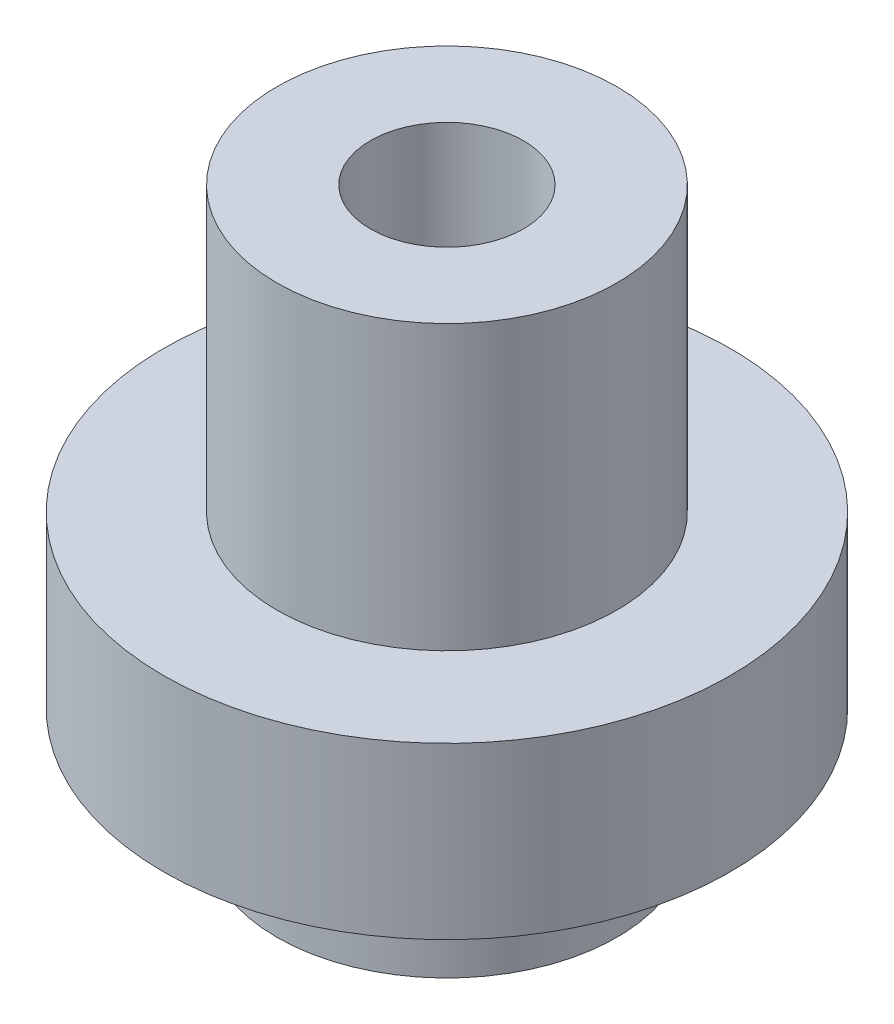
ISO-10303-21;
HEADER;
FILE_DESCRIPTION(('STEP AP214'),'2;1');
FILE_NAME('part.step','',(''),(''),'','','');
FILE_SCHEMA(('AUTOMOTIVE_DESIGN { 1 0 10303 214 1 1 1 1 }'));
ENDSEC;
DATA;
#1=APPLICATION_CONTEXT('core data for automotive mechanical design processes');
#2=APPLICATION_PROTOCOL_DEFINITION('international standard','automotive_design',2000,#1);
#3=PRODUCT_CONTEXT('',#1,'mechanical');
#4=PRODUCT('Part','Part','',(#3));
#5=PRODUCT_RELATED_PRODUCT_CATEGORY('part','',(#4));
#6=PRODUCT_DEFINITION_FORMATION('','',#4);
#7=PRODUCT_DEFINITION_CONTEXT('part definition',#1,'design');
#8=PRODUCT_DEFINITION('design','',#6,#7);
#9=PRODUCT_DEFINITION_SHAPE('','',#8);
#10=(LENGTH_UNIT() NAMED_UNIT(*) SI_UNIT(.MILLI.,.METRE.));
#11=(NAMED_UNIT(*) PLANE_ANGLE_UNIT() SI_UNIT($,.RADIAN.));
#12=(NAMED_UNIT(*) SI_UNIT($,.STERADIAN.) SOLID_ANGLE_UNIT());
#13=UNCERTAINTY_MEASURE_WITH_UNIT(LENGTH_MEASURE(1.E-05),#10,'distance_accuracy_value','');
#14=(GEOMETRIC_REPRESENTATION_CONTEXT(3) GLOBAL_UNCERTAINTY_ASSIGNED_CONTEXT((#13)) GLOBAL_UNIT_ASSIGNED_CONTEXT((#10,
#11,#12)) REPRESENTATION_CONTEXT('',''));
#15=CARTESIAN_POINT('',(0.,0.,0.));
#16=DIRECTION('',(0.,0.,1.));
#17=DIRECTION('',(1.,0.,0.));
#18=AXIS2_PLACEMENT_3D('',#15,#16,#17);
#19=CARTESIAN_POINT('',(0.,0.,0.));
#20=DIRECTION('',(0.,1.,0.));
#21=DIRECTION('',(0.,0.,1.));
#22=AXIS2_PLACEMENT_3D('',#19,#20,#21);
#23=PLANE('',#22);
#24=CARTESIAN_POINT('',(0.,0.,0.));
#25=DIRECTION('',(0.,1.,0.));
#26=DIRECTION('',(0.,0.,1.));
#27=AXIS2_PLACEMENT_3D('',#24,#25,#26);
#28=CIRCLE('',#27,1.35);
#29=CARTESIAN_POINT('',(0.,0.,1.35));
#30=VERTEX_POINT('',#29);
#31=EDGE_CURVE('E68',#30,#30,#28,.T.);
#32=ORIENTED_EDGE('',*,*,#31,.T.);
#33=EDGE_LOOP('',(#32));
#34=FACE_BOUND('',#33,.T.);
#35=CARTESIAN_POINT('',(0.,0.,0.));
#36=DIRECTION('',(0.,1.,0.));
#37=DIRECTION('',(0.,0.,1.));
#38=AXIS2_PLACEMENT_3D('',#35,#36,#37);
#39=CIRCLE('',#38,3.);
#40=CARTESIAN_POINT('',(0.,0.,3.));
#41=VERTEX_POINT('',#40);
#42=EDGE_CURVE('E12',#41,#41,#39,.T.);
#43=ORIENTED_EDGE('',*,*,#42,.F.);
#44=EDGE_LOOP('',(#43));
#45=FACE_BOUND('',#44,.T.);
#46=ADVANCED_FACE('F43',(#34,#45),#23,.F.);
#47=CARTESIAN_POINT('',(0.,10.,0.));
#48=DIRECTION('',(0.,1.,0.));
#49=DIRECTION('',(0.,0.,1.));
#50=AXIS2_PLACEMENT_3D('',#47,#48,#49);
#51=CYLINDRICAL_SURFACE('',#50,3.);
#52=CARTESIAN_POINT('',(0.,2.,0.));
#53=DIRECTION('',(0.,1.,0.));
#54=DIRECTION('',(0.,0.,1.));
#55=AXIS2_PLACEMENT_3D('',#52,#53,#54);
#56=CIRCLE('',#55,3.);
#57=CARTESIAN_POINT('',(0.,2.,3.));
#58=VERTEX_POINT('',#57);
#59=EDGE_CURVE('E49',#58,#58,#56,.T.);
#60=ORIENTED_EDGE('',*,*,#59,.F.);
#61=EDGE_LOOP('',(#60));
#62=FACE_BOUND('',#61,.T.);
#63=ORIENTED_EDGE('',*,*,#42,.T.);
#64=EDGE_LOOP('',(#63));
#65=FACE_BOUND('',#64,.T.);
#66=ADVANCED_FACE('F103',(#62,#65),#51,.T.);
#67=CARTESIAN_POINT('',(0.,2.,-3.));
#68=DIRECTION('',(0.,1.,0.));
#69=DIRECTION('',(0.,0.,1.));
#70=AXIS2_PLACEMENT_3D('',#67,#68,#69);
#71=PLANE('',#70);
#72=CARTESIAN_POINT('',(0.,2.,0.));
#73=DIRECTION('',(0.,1.,0.));
#74=DIRECTION('',(0.,0.,1.));
#75=AXIS2_PLACEMENT_3D('',#72,#73,#74);
#76=CIRCLE('',#75,5.);
#77=CARTESIAN_POINT('',(0.,2.,5.));
#78=VERTEX_POINT('',#77);
#79=EDGE_CURVE('E53',#78,#78,#76,.T.);
#80=ORIENTED_EDGE('',*,*,#79,.F.);
#81=EDGE_LOOP('',(#80));
#82=FACE_BOUND('',#81,.T.);
#83=ORIENTED_EDGE('',*,*,#59,.T.);
#84=EDGE_LOOP('',(#83));
#85=FACE_BOUND('',#84,.T.);
#86=ADVANCED_FACE('F98',(#82,#85),#71,.F.);
#87=CARTESIAN_POINT('',(0.,10.,0.));
#88=DIRECTION('',(0.,1.,0.));
#89=DIRECTION('',(0.,0.,1.));
#90=AXIS2_PLACEMENT_3D('',#87,#88,#89);
#91=CYLINDRICAL_SURFACE('',#90,5.);
#92=CARTESIAN_POINT('',(0.,5.,0.));
#93=DIRECTION('',(0.,1.,0.));
#94=DIRECTION('',(0.,0.,1.));
#95=AXIS2_PLACEMENT_3D('',#92,#93,#94);
#96=CIRCLE('',#95,5.);
#97=CARTESIAN_POINT('',(0.,5.,5.));
#98=VERTEX_POINT('',#97);
#99=EDGE_CURVE('E57',#98,#98,#96,.T.);
#100=ORIENTED_EDGE('',*,*,#99,.F.);
#101=EDGE_LOOP('',(#100));
#102=FACE_BOUND('',#101,.T.);
#103=ORIENTED_EDGE('',*,*,#79,.T.);
#104=EDGE_LOOP('',(#103));
#105=FACE_BOUND('',#104,.T.);
#106=ADVANCED_FACE('F92',(#102,#105),#91,.T.);
#107=CARTESIAN_POINT('',(0.,5.,-5.));
#108=DIRECTION('',(0.,-1.,0.));
#109=DIRECTION('',(0.,0.,-1.));
#110=AXIS2_PLACEMENT_3D('',#107,#108,#109);
#111=PLANE('',#110);
#112=CARTESIAN_POINT('',(0.,5.,0.));
#113=DIRECTION('',(0.,1.,0.));
#114=DIRECTION('',(0.,0.,1.));
#115=AXIS2_PLACEMENT_3D('',#112,#113,#114);
#116=CIRCLE('',#115,3.);
#117=CARTESIAN_POINT('',(0.,5.,3.));
#118=VERTEX_POINT('',#117);
#119=EDGE_CURVE('E62',#118,#118,#116,.T.);
#120=ORIENTED_EDGE('',*,*,#119,.F.);
#121=EDGE_LOOP('',(#120));
#122=FACE_BOUND('',#121,.T.);
#123=ORIENTED_EDGE('',*,*,#99,.T.);
#124=EDGE_LOOP('',(#123));
#125=FACE_BOUND('',#124,.T.);
#126=ADVANCED_FACE('F86',(#122,#125),#111,.F.);
#127=CARTESIAN_POINT('',(0.,10.,0.));
#128=DIRECTION('',(0.,1.,0.));
#129=DIRECTION('',(0.,0.,1.));
#130=AXIS2_PLACEMENT_3D('',#127,#128,#129);
#131=CYLINDRICAL_SURFACE('',#130,3.);
#132=CARTESIAN_POINT('',(0.,10.,0.));
#133=DIRECTION('',(0.,1.,0.));
#134=DIRECTION('',(0.,0.,1.));
#135=AXIS2_PLACEMENT_3D('',#132,#133,#134);
#136=CIRCLE('',#135,3.);
#137=CARTESIAN_POINT('',(0.,10.,3.));
#138=VERTEX_POINT('',#137);
#139=EDGE_CURVE('E65',#138,#138,#136,.T.);
#140=ORIENTED_EDGE('',*,*,#139,.F.);
#141=EDGE_LOOP('',(#140));
#142=FACE_BOUND('',#141,.T.);
#143=ORIENTED_EDGE('',*,*,#119,.T.);
#144=EDGE_LOOP('',(#143));
#145=FACE_BOUND('',#144,.T.);
#146=ADVANCED_FACE('F80',(#142,#145),#131,.T.);
#147=CARTESIAN_POINT('',(0.,10.,-3.));
#148=DIRECTION('',(0.,-1.,0.));
#149=DIRECTION('',(0.,0.,-1.));
#150=AXIS2_PLACEMENT_3D('',#147,#148,#149);
#151=PLANE('',#150);
#152=CARTESIAN_POINT('',(0.,10.,0.));
#153=DIRECTION('',(0.,1.,0.));
#154=DIRECTION('',(0.,0.,1.));
#155=AXIS2_PLACEMENT_3D('',#152,#153,#154);
#156=CIRCLE('',#155,1.35);
#157=CARTESIAN_POINT('',(0.,10.,1.35));
#158=VERTEX_POINT('',#157);
#159=EDGE_CURVE('E71',#158,#158,#156,.T.);
#160=ORIENTED_EDGE('',*,*,#159,.F.);
#161=EDGE_LOOP('',(#160));
#162=FACE_BOUND('',#161,.T.);
#163=ORIENTED_EDGE('',*,*,#139,.T.);
#164=EDGE_LOOP('',(#163));
#165=FACE_BOUND('',#164,.T.);
#166=ADVANCED_FACE('F77',(#162,#165),#151,.F.);
#167=CARTESIAN_POINT('',(0.,10.,0.));
#168=DIRECTION('',(0.,1.,0.));
#169=DIRECTION('',(0.,0.,1.));
#170=AXIS2_PLACEMENT_3D('',#167,#168,#169);
#171=CYLINDRICAL_SURFACE('',#170,1.35);
#172=ORIENTED_EDGE('',*,*,#31,.F.);
#173=EDGE_LOOP('',(#172));
#174=FACE_BOUND('',#173,.T.);
#175=ORIENTED_EDGE('',*,*,#159,.T.);
#176=EDGE_LOOP('',(#175));
#177=FACE_BOUND('',#176,.T.);
#178=ADVANCED_FACE('F75',(#174,#177),#171,.F.);
#179=CLOSED_SHELL('',(#46,#66,#86,#106,#126,#146,#166,#178));
#180=MANIFOLD_SOLID_BREP('B2',#179);
#181=ADVANCED_BREP_SHAPE_REPRESENTATION('',(#18,#180),#14);
#182=SHAPE_DEFINITION_REPRESENTATION(#9,#181);
ENDSEC;
END-ISO-10303-21;
